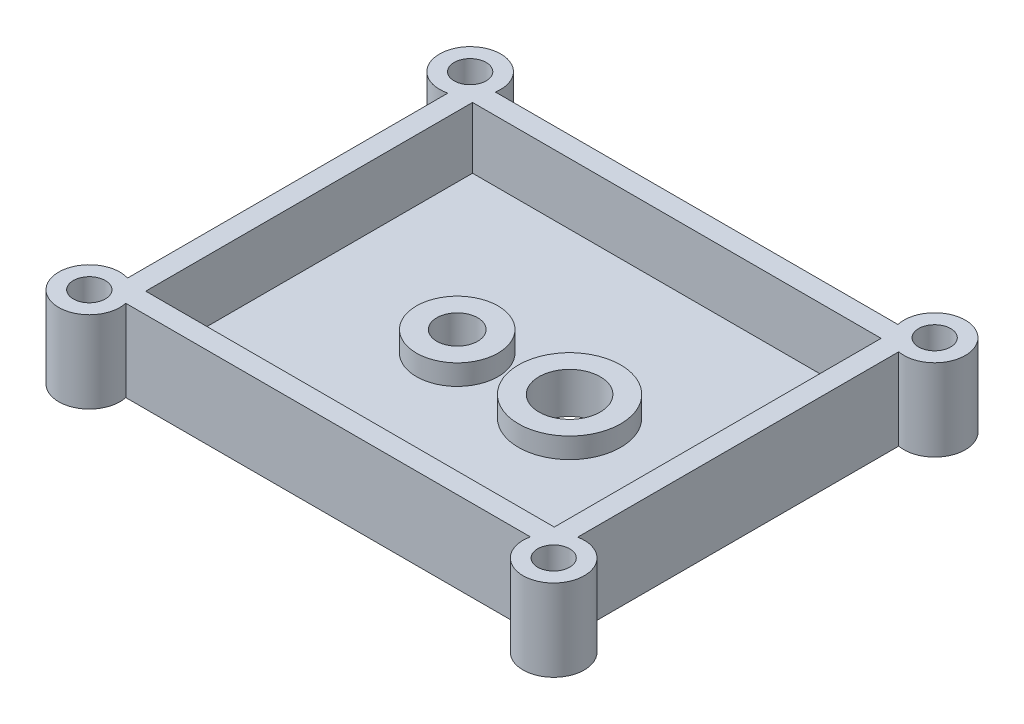
ISO-10303-21;
HEADER;
FILE_DESCRIPTION(('STEP AP214'),'2;1');
FILE_NAME('part.step','',(''),(''),'','','');
FILE_SCHEMA(('AUTOMOTIVE_DESIGN { 1 0 10303 214 1 1 1 1 }'));
ENDSEC;
DATA;
#1=APPLICATION_CONTEXT('core data for automotive mechanical design processes');
#2=APPLICATION_PROTOCOL_DEFINITION('international standard','automotive_design',2000,#1);
#3=PRODUCT_CONTEXT('',#1,'mechanical');
#4=PRODUCT('Part','Part','',(#3));
#5=PRODUCT_RELATED_PRODUCT_CATEGORY('part','',(#4));
#6=PRODUCT_DEFINITION_FORMATION('','',#4);
#7=PRODUCT_DEFINITION_CONTEXT('part definition',#1,'design');
#8=PRODUCT_DEFINITION('design','',#6,#7);
#9=PRODUCT_DEFINITION_SHAPE('','',#8);
#10=(LENGTH_UNIT() NAMED_UNIT(*) SI_UNIT(.MILLI.,.METRE.));
#11=(NAMED_UNIT(*) PLANE_ANGLE_UNIT() SI_UNIT($,.RADIAN.));
#12=(NAMED_UNIT(*) SI_UNIT($,.STERADIAN.) SOLID_ANGLE_UNIT());
#13=UNCERTAINTY_MEASURE_WITH_UNIT(LENGTH_MEASURE(1.E-05),#10,'distance_accuracy_value','');
#14=(GEOMETRIC_REPRESENTATION_CONTEXT(3) GLOBAL_UNCERTAINTY_ASSIGNED_CONTEXT((#13)) GLOBAL_UNIT_ASSIGNED_CONTEXT((#10,
#11,#12)) REPRESENTATION_CONTEXT('',''));
#15=CARTESIAN_POINT('',(0.,0.,0.));
#16=DIRECTION('',(0.,0.,1.));
#17=DIRECTION('',(1.,0.,0.));
#18=AXIS2_PLACEMENT_3D('',#15,#16,#17);
#19=CARTESIAN_POINT('',(34.925,12.7,28.575));
#20=DIRECTION('',(-1.,0.,0.));
#21=DIRECTION('',(0.,0.,1.));
#22=AXIS2_PLACEMENT_3D('',#19,#20,#21);
#23=PLANE('',#22);
#24=DIRECTION('',(0.,0.,-1.));
#25=VECTOR('',#24,1.);
#26=CARTESIAN_POINT('',(34.925,12.7,28.575));
#27=LINE('',#26,#25);
#28=CARTESIAN_POINT('',(34.925,12.7,24.9397895282315));
#29=VERTEX_POINT('',#28);
#30=CARTESIAN_POINT('',(34.925,12.7,-24.9617511410447));
#31=VERTEX_POINT('',#30);
#32=EDGE_CURVE('E165',#29,#31,#27,.T.);
#33=ORIENTED_EDGE('',*,*,#32,.F.);
#34=DIRECTION('',(0.,1.,0.));
#35=VECTOR('',#34,1.);
#36=CARTESIAN_POINT('',(34.925,0.,24.9397895282315));
#37=LINE('',#36,#35);
#38=CARTESIAN_POINT('',(34.925,0.,24.9397895282315));
#39=VERTEX_POINT('',#38);
#40=EDGE_CURVE('E234',#29,#39,#37,.F.);
#41=ORIENTED_EDGE('',*,*,#40,.T.);
#42=DIRECTION('',(0.,0.,-1.));
#43=VECTOR('',#42,1.);
#44=CARTESIAN_POINT('',(34.925,0.,28.575));
#45=LINE('',#44,#43);
#46=CARTESIAN_POINT('',(34.925,0.,-24.9617511410447));
#47=VERTEX_POINT('',#46);
#48=EDGE_CURVE('E155',#39,#47,#45,.T.);
#49=ORIENTED_EDGE('',*,*,#48,.T.);
#50=DIRECTION('',(0.,1.,0.));
#51=VECTOR('',#50,1.);
#52=CARTESIAN_POINT('',(34.925,0.,-24.9617511410447));
#53=LINE('',#52,#51);
#54=EDGE_CURVE('E239',#47,#31,#53,.T.);
#55=ORIENTED_EDGE('',*,*,#54,.T.);
#56=EDGE_LOOP('',(#33,#41,#49,#55));
#57=FACE_BOUND('',#56,.T.);
#58=ADVANCED_FACE('F39',(#57),#23,.F.);
#59=CARTESIAN_POINT('',(-34.925,12.7,-28.575));
#60=DIRECTION('',(0.,0.,1.));
#61=DIRECTION('',(1.,0.,0.));
#62=AXIS2_PLACEMENT_3D('',#59,#60,#61);
#63=PLANE('',#62);
#64=DIRECTION('',(-1.,0.,0.));
#65=VECTOR('',#64,1.);
#66=CARTESIAN_POINT('',(-34.925,12.7,-28.575));
#67=LINE('',#66,#65);
#68=CARTESIAN_POINT('',(31.1900740487613,12.7,-28.575));
#69=VERTEX_POINT('',#68);
#70=CARTESIAN_POINT('',(-31.3834978217363,12.7,-28.575));
#71=VERTEX_POINT('',#70);
#72=EDGE_CURVE('E175',#69,#71,#67,.T.);
#73=ORIENTED_EDGE('',*,*,#72,.F.);
#74=DIRECTION('',(0.,1.,0.));
#75=VECTOR('',#74,1.);
#76=CARTESIAN_POINT('',(31.1900740487613,0.,-28.575));
#77=LINE('',#76,#75);
#78=CARTESIAN_POINT('',(31.1900740487613,0.,-28.575));
#79=VERTEX_POINT('',#78);
#80=EDGE_CURVE('E140',#69,#79,#77,.F.);
#81=ORIENTED_EDGE('',*,*,#80,.T.);
#82=DIRECTION('',(-1.,0.,0.));
#83=VECTOR('',#82,1.);
#84=CARTESIAN_POINT('',(-34.925,0.,-28.575));
#85=LINE('',#84,#83);
#86=CARTESIAN_POINT('',(-31.3834978217363,0.,-28.575));
#87=VERTEX_POINT('',#86);
#88=EDGE_CURVE('E148',#79,#87,#85,.T.);
#89=ORIENTED_EDGE('',*,*,#88,.T.);
#90=DIRECTION('',(0.,1.,0.));
#91=VECTOR('',#90,1.);
#92=CARTESIAN_POINT('',(-31.3834978217363,0.,-28.575));
#93=LINE('',#92,#91);
#94=EDGE_CURVE('E127',#87,#71,#93,.T.);
#95=ORIENTED_EDGE('',*,*,#94,.T.);
#96=EDGE_LOOP('',(#73,#81,#89,#95));
#97=FACE_BOUND('',#96,.T.);
#98=ADVANCED_FACE('F151',(#97),#63,.F.);
#99=CARTESIAN_POINT('',(-34.925,12.7,28.575));
#100=DIRECTION('',(1.,0.,0.));
#101=DIRECTION('',(0.,0.,-1.));
#102=AXIS2_PLACEMENT_3D('',#99,#100,#101);
#103=PLANE('',#102);
#104=DIRECTION('',(0.,0.,1.));
#105=VECTOR('',#104,1.);
#106=CARTESIAN_POINT('',(-34.925,0.,28.575));
#107=LINE('',#106,#105);
#108=CARTESIAN_POINT('',(-34.925,0.,-24.7393888212025));
#109=VERTEX_POINT('',#108);
#110=CARTESIAN_POINT('',(-34.925,0.,25.0375604846747));
#111=VERTEX_POINT('',#110);
#112=EDGE_CURVE('E149',#109,#111,#107,.T.);
#113=ORIENTED_EDGE('',*,*,#112,.T.);
#114=DIRECTION('',(0.,1.,0.));
#115=VECTOR('',#114,1.);
#116=CARTESIAN_POINT('',(-34.925,0.,25.0375604846747));
#117=LINE('',#116,#115);
#118=CARTESIAN_POINT('',(-34.925,12.7,25.0375604846747));
#119=VERTEX_POINT('',#118);
#120=EDGE_CURVE('E230',#111,#119,#117,.T.);
#121=ORIENTED_EDGE('',*,*,#120,.T.);
#122=DIRECTION('',(0.,0.,1.));
#123=VECTOR('',#122,1.);
#124=CARTESIAN_POINT('',(-34.925,12.7,28.575));
#125=LINE('',#124,#123);
#126=CARTESIAN_POINT('',(-34.925,12.7,-24.7393888212025));
#127=VERTEX_POINT('',#126);
#128=EDGE_CURVE('E169',#127,#119,#125,.T.);
#129=ORIENTED_EDGE('',*,*,#128,.F.);
#130=DIRECTION('',(0.,1.,0.));
#131=VECTOR('',#130,1.);
#132=CARTESIAN_POINT('',(-34.925,0.,-24.7393888212025));
#133=LINE('',#132,#131);
#134=EDGE_CURVE('E136',#127,#109,#133,.F.);
#135=ORIENTED_EDGE('',*,*,#134,.T.);
#136=EDGE_LOOP('',(#113,#121,#129,#135));
#137=FACE_BOUND('',#136,.T.);
#138=ADVANCED_FACE('F335',(#137),#103,.F.);
#139=CARTESIAN_POINT('',(-34.925,12.7,28.575));
#140=DIRECTION('',(0.,0.,-1.));
#141=DIRECTION('',(-1.,0.,0.));
#142=AXIS2_PLACEMENT_3D('',#139,#140,#141);
#143=PLANE('',#142);
#144=DIRECTION('',(1.,0.,0.));
#145=VECTOR('',#144,1.);
#146=CARTESIAN_POINT('',(-34.925,12.7,28.575));
#147=LINE('',#146,#145);
#148=CARTESIAN_POINT('',(-31.6690390316661,12.7,28.575));
#149=VERTEX_POINT('',#148);
#150=CARTESIAN_POINT('',(31.2158026670803,12.7,28.575));
#151=VERTEX_POINT('',#150);
#152=EDGE_CURVE('E163',#149,#151,#147,.T.);
#153=ORIENTED_EDGE('',*,*,#152,.F.);
#154=DIRECTION('',(0.,1.,0.));
#155=VECTOR('',#154,1.);
#156=CARTESIAN_POINT('',(-31.6690390316661,0.,28.575));
#157=LINE('',#156,#155);
#158=CARTESIAN_POINT('',(-31.6690390316661,0.,28.575));
#159=VERTEX_POINT('',#158);
#160=EDGE_CURVE('E233',#149,#159,#157,.F.);
#161=ORIENTED_EDGE('',*,*,#160,.T.);
#162=DIRECTION('',(1.,0.,0.));
#163=VECTOR('',#162,1.);
#164=CARTESIAN_POINT('',(-34.925,0.,28.575));
#165=LINE('',#164,#163);
#166=CARTESIAN_POINT('',(31.2158026670803,0.,28.575));
#167=VERTEX_POINT('',#166);
#168=EDGE_CURVE('E152',#159,#167,#165,.T.);
#169=ORIENTED_EDGE('',*,*,#168,.T.);
#170=DIRECTION('',(0.,1.,0.));
#171=VECTOR('',#170,1.);
#172=CARTESIAN_POINT('',(31.2158026670803,0.,28.575));
#173=LINE('',#172,#171);
#174=EDGE_CURVE('E240',#167,#151,#173,.T.);
#175=ORIENTED_EDGE('',*,*,#174,.T.);
#176=EDGE_LOOP('',(#153,#161,#169,#175));
#177=FACE_BOUND('',#176,.T.);
#178=ADVANCED_FACE('F288',(#177),#143,.F.);
#179=CARTESIAN_POINT('',(0.,12.7,0.));
#180=DIRECTION('',(0.,-1.,0.));
#181=DIRECTION('',(0.,0.,-1.));
#182=AXIS2_PLACEMENT_3D('',#179,#180,#181);
#183=PLANE('',#182);
#184=CARTESIAN_POINT('',(35.8326653027773,12.7,-29.6369570133175));
#185=DIRECTION('',(0.,1.,0.));
#186=DIRECTION('',(0.,0.,1.));
#187=AXIS2_PLACEMENT_3D('',#184,#185,#186);
#188=CIRCLE('',#187,2.4892);
#189=CARTESIAN_POINT('',(35.8326653027773,12.7,-27.1477570133175));
#190=VERTEX_POINT('',#189);
#191=EDGE_CURVE('E266',#190,#190,#188,.T.);
#192=ORIENTED_EDGE('',*,*,#191,.F.);
#193=EDGE_LOOP('',(#192));
#194=FACE_BOUND('',#193,.T.);
#195=CARTESIAN_POINT('',(35.8647791179222,12.7,29.6086460755585));
#196=DIRECTION('',(0.,1.,0.));
#197=DIRECTION('',(0.,0.,1.));
#198=AXIS2_PLACEMENT_3D('',#195,#196,#197);
#199=CIRCLE('',#198,2.4892);
#200=CARTESIAN_POINT('',(35.8647791179222,12.7,32.0978460755585));
#201=VERTEX_POINT('',#200);
#202=EDGE_CURVE('E275',#201,#201,#199,.T.);
#203=ORIENTED_EDGE('',*,*,#202,.F.);
#204=EDGE_LOOP('',(#203));
#205=FACE_BOUND('',#204,.T.);
#206=CARTESIAN_POINT('',(-36.322,12.7,29.5905591943165));
#207=DIRECTION('',(0.,1.,0.));
#208=DIRECTION('',(0.,0.,1.));
#209=AXIS2_PLACEMENT_3D('',#206,#207,#208);
#210=CIRCLE('',#209,2.4892);
#211=CARTESIAN_POINT('',(-36.322,12.7,32.0797591943165));
#212=VERTEX_POINT('',#211);
#213=EDGE_CURVE('E257',#212,#212,#210,.T.);
#214=ORIENTED_EDGE('',*,*,#213,.F.);
#215=EDGE_LOOP('',(#214));
#216=FACE_BOUND('',#215,.T.);
#217=CARTESIAN_POINT('',(-36.0809444494494,12.7,-29.3594752576004));
#218=DIRECTION('',(0.,1.,0.));
#219=DIRECTION('',(0.,0.,1.));
#220=AXIS2_PLACEMENT_3D('',#217,#218,#219);
#221=CIRCLE('',#220,2.4892);
#222=CARTESIAN_POINT('',(-36.0809444494494,12.7,-26.8702752576004));
#223=VERTEX_POINT('',#222);
#224=EDGE_CURVE('E260',#223,#223,#221,.T.);
#225=ORIENTED_EDGE('',*,*,#224,.F.);
#226=EDGE_LOOP('',(#225));
#227=FACE_BOUND('',#226,.T.);
#228=CARTESIAN_POINT('',(35.8647791179222,12.7,29.6086460755585));
#229=DIRECTION('',(0.,1.,0.));
#230=DIRECTION('',(0.,0.,1.));
#231=AXIS2_PLACEMENT_3D('',#228,#229,#230);
#232=CIRCLE('',#231,4.7625);
#233=EDGE_CURVE('E52',#151,#29,#232,.T.);
#234=ORIENTED_EDGE('',*,*,#233,.T.);
#235=ORIENTED_EDGE('',*,*,#32,.T.);
#236=CARTESIAN_POINT('',(35.8326653027773,12.7,-29.6369570133175));
#237=DIRECTION('',(0.,1.,0.));
#238=DIRECTION('',(0.,0.,1.));
#239=AXIS2_PLACEMENT_3D('',#236,#237,#238);
#240=CIRCLE('',#239,4.7625);
#241=EDGE_CURVE('E243',#31,#69,#240,.T.);
#242=ORIENTED_EDGE('',*,*,#241,.T.);
#243=ORIENTED_EDGE('',*,*,#72,.T.);
#244=CARTESIAN_POINT('',(-36.0809444494494,12.7,-29.3594752576004));
#245=DIRECTION('',(0.,1.,0.));
#246=DIRECTION('',(0.,0.,1.));
#247=AXIS2_PLACEMENT_3D('',#244,#245,#246);
#248=CIRCLE('',#247,4.7625);
#249=EDGE_CURVE('E131',#71,#127,#248,.T.);
#250=ORIENTED_EDGE('',*,*,#249,.T.);
#251=ORIENTED_EDGE('',*,*,#128,.T.);
#252=CARTESIAN_POINT('',(-36.322,12.7,29.5905591943165));
#253=DIRECTION('',(0.,1.,0.));
#254=DIRECTION('',(0.,0.,1.));
#255=AXIS2_PLACEMENT_3D('',#252,#253,#254);
#256=CIRCLE('',#255,4.7625);
#257=EDGE_CURVE('E246',#119,#149,#256,.T.);
#258=ORIENTED_EDGE('',*,*,#257,.T.);
#259=ORIENTED_EDGE('',*,*,#152,.T.);
#260=EDGE_LOOP('',(#234,#235,#242,#243,#250,#251,#258,#259));
#261=FACE_BOUND('',#260,.T.);
#262=DIRECTION('',(-1.,0.,0.));
#263=VECTOR('',#262,1.);
#264=CARTESIAN_POINT('',(-31.75,12.7,-25.4));
#265=LINE('',#264,#263);
#266=CARTESIAN_POINT('',(31.75,12.7,-25.4));
#267=VERTEX_POINT('',#266);
#268=CARTESIAN_POINT('',(-31.75,12.7,-25.4));
#269=VERTEX_POINT('',#268);
#270=EDGE_CURVE('E192',#267,#269,#265,.T.);
#271=ORIENTED_EDGE('',*,*,#270,.F.);
#272=DIRECTION('',(0.,0.,-1.));
#273=VECTOR('',#272,1.);
#274=CARTESIAN_POINT('',(31.75,12.7,25.4));
#275=LINE('',#274,#273);
#276=CARTESIAN_POINT('',(31.75,12.7,25.4));
#277=VERTEX_POINT('',#276);
#278=EDGE_CURVE('E196',#277,#267,#275,.T.);
#279=ORIENTED_EDGE('',*,*,#278,.F.);
#280=DIRECTION('',(1.,0.,0.));
#281=VECTOR('',#280,1.);
#282=CARTESIAN_POINT('',(-31.75,12.7,25.4));
#283=LINE('',#282,#281);
#284=CARTESIAN_POINT('',(-31.75,12.7,25.4));
#285=VERTEX_POINT('',#284);
#286=EDGE_CURVE('E190',#285,#277,#283,.T.);
#287=ORIENTED_EDGE('',*,*,#286,.F.);
#288=DIRECTION('',(0.,0.,1.));
#289=VECTOR('',#288,1.);
#290=CARTESIAN_POINT('',(-31.75,12.7,25.4));
#291=LINE('',#290,#289);
#292=EDGE_CURVE('E195',#269,#285,#291,.T.);
#293=ORIENTED_EDGE('',*,*,#292,.F.);
#294=EDGE_LOOP('',(#271,#279,#287,#293));
#295=FACE_BOUND('',#294,.T.);
#296=ADVANCED_FACE('F285',(#194,#205,#216,#227,#261,#295),#183,.F.);
#297=CARTESIAN_POINT('',(0.,0.,0.));
#298=DIRECTION('',(0.,-1.,0.));
#299=DIRECTION('',(0.,0.,-1.));
#300=AXIS2_PLACEMENT_3D('',#297,#298,#299);
#301=PLANE('',#300);
#302=CARTESIAN_POINT('',(35.8326653027773,0.,-29.6369570133175));
#303=DIRECTION('',(0.,1.,0.));
#304=DIRECTION('',(0.,0.,1.));
#305=AXIS2_PLACEMENT_3D('',#302,#303,#304);
#306=CIRCLE('',#305,2.4892);
#307=CARTESIAN_POINT('',(35.8326653027773,0.,-27.1477570133175));
#308=VERTEX_POINT('',#307);
#309=EDGE_CURVE('E263',#308,#308,#306,.T.);
#310=ORIENTED_EDGE('',*,*,#309,.T.);
#311=EDGE_LOOP('',(#310));
#312=FACE_BOUND('',#311,.T.);
#313=CARTESIAN_POINT('',(35.8647791179222,0.,29.6086460755585));
#314=DIRECTION('',(0.,1.,0.));
#315=DIRECTION('',(0.,0.,1.));
#316=AXIS2_PLACEMENT_3D('',#313,#314,#315);
#317=CIRCLE('',#316,2.4892);
#318=CARTESIAN_POINT('',(35.8647791179222,0.,32.0978460755585));
#319=VERTEX_POINT('',#318);
#320=EDGE_CURVE('E267',#319,#319,#317,.T.);
#321=ORIENTED_EDGE('',*,*,#320,.T.);
#322=EDGE_LOOP('',(#321));
#323=FACE_BOUND('',#322,.T.);
#324=CARTESIAN_POINT('',(-36.322,0.,29.5905591943165));
#325=DIRECTION('',(0.,1.,0.));
#326=DIRECTION('',(0.,0.,1.));
#327=AXIS2_PLACEMENT_3D('',#324,#325,#326);
#328=CIRCLE('',#327,2.4892);
#329=CARTESIAN_POINT('',(-36.322,0.,32.0797591943165));
#330=VERTEX_POINT('',#329);
#331=EDGE_CURVE('E274',#330,#330,#328,.T.);
#332=ORIENTED_EDGE('',*,*,#331,.T.);
#333=EDGE_LOOP('',(#332));
#334=FACE_BOUND('',#333,.T.);
#335=CARTESIAN_POINT('',(-36.0809444494494,0.,-29.3594752576004));
#336=DIRECTION('',(0.,1.,0.));
#337=DIRECTION('',(0.,0.,1.));
#338=AXIS2_PLACEMENT_3D('',#335,#336,#337);
#339=CIRCLE('',#338,2.4892);
#340=CARTESIAN_POINT('',(-36.0809444494494,0.,-26.8702752576004));
#341=VERTEX_POINT('',#340);
#342=EDGE_CURVE('E249',#341,#341,#339,.T.);
#343=ORIENTED_EDGE('',*,*,#342,.T.);
#344=EDGE_LOOP('',(#343));
#345=FACE_BOUND('',#344,.T.);
#346=ORIENTED_EDGE('',*,*,#168,.F.);
#347=CARTESIAN_POINT('',(-36.322,0.,29.5905591943165));
#348=DIRECTION('',(0.,1.,0.));
#349=DIRECTION('',(0.,0.,1.));
#350=AXIS2_PLACEMENT_3D('',#347,#348,#349);
#351=CIRCLE('',#350,4.7625);
#352=EDGE_CURVE('E248',#111,#159,#351,.T.);
#353=ORIENTED_EDGE('',*,*,#352,.F.);
#354=ORIENTED_EDGE('',*,*,#112,.F.);
#355=CARTESIAN_POINT('',(-36.0809444494494,0.,-29.3594752576004));
#356=DIRECTION('',(0.,1.,0.));
#357=DIRECTION('',(0.,0.,1.));
#358=AXIS2_PLACEMENT_3D('',#355,#356,#357);
#359=CIRCLE('',#358,4.7625);
#360=EDGE_CURVE('E129',#87,#109,#359,.T.);
#361=ORIENTED_EDGE('',*,*,#360,.F.);
#362=ORIENTED_EDGE('',*,*,#88,.F.);
#363=CARTESIAN_POINT('',(35.8326653027773,0.,-29.6369570133175));
#364=DIRECTION('',(0.,1.,0.));
#365=DIRECTION('',(0.,0.,1.));
#366=AXIS2_PLACEMENT_3D('',#363,#364,#365);
#367=CIRCLE('',#366,4.7625);
#368=EDGE_CURVE('E64',#47,#79,#367,.T.);
#369=ORIENTED_EDGE('',*,*,#368,.F.);
#370=ORIENTED_EDGE('',*,*,#48,.F.);
#371=CARTESIAN_POINT('',(35.8647791179222,0.,29.6086460755585));
#372=DIRECTION('',(0.,1.,0.));
#373=DIRECTION('',(0.,0.,1.));
#374=AXIS2_PLACEMENT_3D('',#371,#372,#373);
#375=CIRCLE('',#374,4.7625);
#376=EDGE_CURVE('E253',#167,#39,#375,.T.);
#377=ORIENTED_EDGE('',*,*,#376,.F.);
#378=EDGE_LOOP('',(#346,#353,#354,#361,#362,#369,#370,#377));
#379=FACE_BOUND('',#378,.T.);
#380=CARTESIAN_POINT('',(8.73125,0.,0.));
#381=DIRECTION('',(0.,1.,0.));
#382=DIRECTION('',(0.,0.,1.));
#383=AXIS2_PLACEMENT_3D('',#380,#381,#382);
#384=CIRCLE('',#383,4.7625);
#385=CARTESIAN_POINT('',(8.73125,0.,4.7625));
#386=VERTEX_POINT('',#385);
#387=EDGE_CURVE('E223',#386,#386,#384,.T.);
#388=ORIENTED_EDGE('',*,*,#387,.T.);
#389=EDGE_LOOP('',(#388));
#390=FACE_BOUND('',#389,.T.);
#391=CARTESIAN_POINT('',(-8.73125,0.,0.));
#392=DIRECTION('',(0.,1.,0.));
#393=DIRECTION('',(0.,0.,1.));
#394=AXIS2_PLACEMENT_3D('',#391,#392,#393);
#395=CIRCLE('',#394,3.175);
#396=CARTESIAN_POINT('',(-8.73125,0.,3.175));
#397=VERTEX_POINT('',#396);
#398=EDGE_CURVE('E217',#397,#397,#395,.T.);
#399=ORIENTED_EDGE('',*,*,#398,.T.);
#400=EDGE_LOOP('',(#399));
#401=FACE_BOUND('',#400,.T.);
#402=ADVANCED_FACE('F145',(#312,#323,#334,#345,#379,#390,#401),#301,.T.);
#403=CARTESIAN_POINT('',(31.75,3.175,25.4));
#404=DIRECTION('',(1.,0.,0.));
#405=DIRECTION('',(0.,0.,-1.));
#406=AXIS2_PLACEMENT_3D('',#403,#404,#405);
#407=PLANE('',#406);
#408=ORIENTED_EDGE('',*,*,#278,.T.);
#409=DIRECTION('',(0.,1.,0.));
#410=VECTOR('',#409,1.);
#411=CARTESIAN_POINT('',(31.75,3.175,-25.4));
#412=LINE('',#411,#410);
#413=CARTESIAN_POINT('',(31.75,3.175,-25.4));
#414=VERTEX_POINT('',#413);
#415=EDGE_CURVE('E179',#414,#267,#412,.T.);
#416=ORIENTED_EDGE('',*,*,#415,.F.);
#417=DIRECTION('',(0.,0.,-1.));
#418=VECTOR('',#417,1.);
#419=CARTESIAN_POINT('',(31.75,3.175,25.4));
#420=LINE('',#419,#418);
#421=CARTESIAN_POINT('',(31.75,3.175,25.4));
#422=VERTEX_POINT('',#421);
#423=EDGE_CURVE('E193',#422,#414,#420,.T.);
#424=ORIENTED_EDGE('',*,*,#423,.F.);
#425=DIRECTION('',(0.,1.,0.));
#426=VECTOR('',#425,1.);
#427=CARTESIAN_POINT('',(31.75,3.175,25.4));
#428=LINE('',#427,#426);
#429=EDGE_CURVE('E160',#422,#277,#428,.T.);
#430=ORIENTED_EDGE('',*,*,#429,.T.);
#431=EDGE_LOOP('',(#408,#416,#424,#430));
#432=FACE_BOUND('',#431,.T.);
#433=ADVANCED_FACE('F305',(#432),#407,.F.);
#434=CARTESIAN_POINT('',(-31.75,3.175,25.4));
#435=DIRECTION('',(0.,0.,1.));
#436=DIRECTION('',(1.,0.,0.));
#437=AXIS2_PLACEMENT_3D('',#434,#435,#436);
#438=PLANE('',#437);
#439=ORIENTED_EDGE('',*,*,#286,.T.);
#440=ORIENTED_EDGE('',*,*,#429,.F.);
#441=DIRECTION('',(1.,0.,0.));
#442=VECTOR('',#441,1.);
#443=CARTESIAN_POINT('',(-31.75,3.175,25.4));
#444=LINE('',#443,#442);
#445=CARTESIAN_POINT('',(-31.75,3.175,25.4));
#446=VERTEX_POINT('',#445);
#447=EDGE_CURVE('E181',#446,#422,#444,.T.);
#448=ORIENTED_EDGE('',*,*,#447,.F.);
#449=DIRECTION('',(0.,1.,0.));
#450=VECTOR('',#449,1.);
#451=CARTESIAN_POINT('',(-31.75,3.175,25.4));
#452=LINE('',#451,#450);
#453=EDGE_CURVE('E183',#446,#285,#452,.T.);
#454=ORIENTED_EDGE('',*,*,#453,.T.);
#455=EDGE_LOOP('',(#439,#440,#448,#454));
#456=FACE_BOUND('',#455,.T.);
#457=ADVANCED_FACE('F302',(#456),#438,.F.);
#458=CARTESIAN_POINT('',(-31.75,3.175,25.4));
#459=DIRECTION('',(-1.,0.,0.));
#460=DIRECTION('',(0.,0.,1.));
#461=AXIS2_PLACEMENT_3D('',#458,#459,#460);
#462=PLANE('',#461);
#463=ORIENTED_EDGE('',*,*,#292,.T.);
#464=ORIENTED_EDGE('',*,*,#453,.F.);
#465=DIRECTION('',(0.,0.,1.));
#466=VECTOR('',#465,1.);
#467=CARTESIAN_POINT('',(-31.75,3.175,25.4));
#468=LINE('',#467,#466);
#469=CARTESIAN_POINT('',(-31.75,3.175,-25.4));
#470=VERTEX_POINT('',#469);
#471=EDGE_CURVE('E201',#470,#446,#468,.T.);
#472=ORIENTED_EDGE('',*,*,#471,.F.);
#473=DIRECTION('',(0.,1.,0.));
#474=VECTOR('',#473,1.);
#475=CARTESIAN_POINT('',(-31.75,3.175,-25.4));
#476=LINE('',#475,#474);
#477=EDGE_CURVE('E185',#470,#269,#476,.T.);
#478=ORIENTED_EDGE('',*,*,#477,.T.);
#479=EDGE_LOOP('',(#463,#464,#472,#478));
#480=FACE_BOUND('',#479,.T.);
#481=ADVANCED_FACE('F307',(#480),#462,.F.);
#482=CARTESIAN_POINT('',(-31.75,3.175,-25.4));
#483=DIRECTION('',(0.,0.,-1.));
#484=DIRECTION('',(-1.,0.,0.));
#485=AXIS2_PLACEMENT_3D('',#482,#483,#484);
#486=PLANE('',#485);
#487=ORIENTED_EDGE('',*,*,#270,.T.);
#488=ORIENTED_EDGE('',*,*,#477,.F.);
#489=DIRECTION('',(-1.,0.,0.));
#490=VECTOR('',#489,1.);
#491=CARTESIAN_POINT('',(-31.75,3.175,-25.4));
#492=LINE('',#491,#490);
#493=EDGE_CURVE('E206',#414,#470,#492,.T.);
#494=ORIENTED_EDGE('',*,*,#493,.F.);
#495=ORIENTED_EDGE('',*,*,#415,.T.);
#496=EDGE_LOOP('',(#487,#488,#494,#495));
#497=FACE_BOUND('',#496,.T.);
#498=ADVANCED_FACE('F296',(#497),#486,.F.);
#499=CARTESIAN_POINT('',(0.,3.175,0.));
#500=DIRECTION('',(0.,-1.,0.));
#501=DIRECTION('',(0.,0.,-1.));
#502=AXIS2_PLACEMENT_3D('',#499,#500,#501);
#503=PLANE('',#502);
#504=CARTESIAN_POINT('',(-8.73125,3.175,0.));
#505=DIRECTION('',(0.,-1.,0.));
#506=DIRECTION('',(0.,0.,-1.));
#507=AXIS2_PLACEMENT_3D('',#504,#505,#506);
#508=CIRCLE('',#507,6.35);
#509=CARTESIAN_POINT('',(-8.73125,3.175,-6.35));
#510=VERTEX_POINT('',#509);
#511=EDGE_CURVE('E11',#510,#510,#508,.F.);
#512=ORIENTED_EDGE('',*,*,#511,.F.);
#513=EDGE_LOOP('',(#512));
#514=FACE_BOUND('',#513,.T.);
#515=CARTESIAN_POINT('',(8.73125,3.175,0.));
#516=DIRECTION('',(0.,-1.,0.));
#517=DIRECTION('',(0.,0.,-1.));
#518=AXIS2_PLACEMENT_3D('',#515,#516,#517);
#519=CIRCLE('',#518,7.9375);
#520=CARTESIAN_POINT('',(8.73125,3.175,-7.9375));
#521=VERTEX_POINT('',#520);
#522=EDGE_CURVE('E46',#521,#521,#519,.F.);
#523=ORIENTED_EDGE('',*,*,#522,.F.);
#524=EDGE_LOOP('',(#523));
#525=FACE_BOUND('',#524,.T.);
#526=ORIENTED_EDGE('',*,*,#423,.T.);
#527=ORIENTED_EDGE('',*,*,#493,.T.);
#528=ORIENTED_EDGE('',*,*,#471,.T.);
#529=ORIENTED_EDGE('',*,*,#447,.T.);
#530=EDGE_LOOP('',(#526,#527,#528,#529));
#531=FACE_BOUND('',#530,.T.);
#532=ADVANCED_FACE('F310',(#514,#525,#531),#503,.F.);
#533=CARTESIAN_POINT('',(8.73125,6.35,0.));
#534=DIRECTION('',(0.,1.,0.));
#535=DIRECTION('',(0.,0.,1.));
#536=AXIS2_PLACEMENT_3D('',#533,#534,#535);
#537=PLANE('',#536);
#538=CARTESIAN_POINT('',(8.73125,6.35,0.));
#539=DIRECTION('',(0.,1.,0.));
#540=DIRECTION('',(0.,0.,1.));
#541=AXIS2_PLACEMENT_3D('',#538,#539,#540);
#542=CIRCLE('',#541,7.9375);
#543=CARTESIAN_POINT('',(8.73125,6.35,7.9375));
#544=VERTEX_POINT('',#543);
#545=EDGE_CURVE('E214',#544,#544,#542,.T.);
#546=ORIENTED_EDGE('',*,*,#545,.T.);
#547=EDGE_LOOP('',(#546));
#548=FACE_BOUND('',#547,.T.);
#549=CARTESIAN_POINT('',(8.73125,6.35,0.));
#550=DIRECTION('',(0.,1.,0.));
#551=DIRECTION('',(0.,0.,1.));
#552=AXIS2_PLACEMENT_3D('',#549,#550,#551);
#553=CIRCLE('',#552,4.7625);
#554=CARTESIAN_POINT('',(8.73125,6.35,4.7625));
#555=VERTEX_POINT('',#554);
#556=EDGE_CURVE('E211',#555,#555,#553,.T.);
#557=ORIENTED_EDGE('',*,*,#556,.F.);
#558=EDGE_LOOP('',(#557));
#559=FACE_BOUND('',#558,.T.);
#560=ADVANCED_FACE('F313',(#548,#559),#537,.T.);
#561=CARTESIAN_POINT('',(8.73125,6.35,0.));
#562=DIRECTION('',(0.,-1.,0.));
#563=DIRECTION('',(0.,0.,-1.));
#564=AXIS2_PLACEMENT_3D('',#561,#562,#563);
#565=CYLINDRICAL_SURFACE('',#564,7.9375);
#566=ORIENTED_EDGE('',*,*,#545,.F.);
#567=EDGE_LOOP('',(#566));
#568=FACE_BOUND('',#567,.T.);
#569=ORIENTED_EDGE('',*,*,#522,.T.);
#570=EDGE_LOOP('',(#569));
#571=FACE_BOUND('',#570,.T.);
#572=ADVANCED_FACE('F318',(#568,#571),#565,.T.);
#573=CARTESIAN_POINT('',(8.73125,6.35,0.));
#574=DIRECTION('',(0.,-1.,0.));
#575=DIRECTION('',(0.,0.,-1.));
#576=AXIS2_PLACEMENT_3D('',#573,#574,#575);
#577=CYLINDRICAL_SURFACE('',#576,4.7625);
#578=ORIENTED_EDGE('',*,*,#556,.T.);
#579=EDGE_LOOP('',(#578));
#580=FACE_BOUND('',#579,.T.);
#581=ORIENTED_EDGE('',*,*,#387,.F.);
#582=EDGE_LOOP('',(#581));
#583=FACE_BOUND('',#582,.T.);
#584=ADVANCED_FACE('F386',(#580,#583),#577,.F.);
#585=CARTESIAN_POINT('',(-8.73125,6.35,0.));
#586=DIRECTION('',(0.,1.,0.));
#587=DIRECTION('',(0.,0.,1.));
#588=AXIS2_PLACEMENT_3D('',#585,#586,#587);
#589=PLANE('',#588);
#590=CARTESIAN_POINT('',(-8.73125,6.35,0.));
#591=DIRECTION('',(0.,1.,0.));
#592=DIRECTION('',(0.,0.,1.));
#593=AXIS2_PLACEMENT_3D('',#590,#591,#592);
#594=CIRCLE('',#593,6.35);
#595=CARTESIAN_POINT('',(-8.73125,6.35,6.35));
#596=VERTEX_POINT('',#595);
#597=EDGE_CURVE('E199',#596,#596,#594,.T.);
#598=ORIENTED_EDGE('',*,*,#597,.T.);
#599=EDGE_LOOP('',(#598));
#600=FACE_BOUND('',#599,.T.);
#601=CARTESIAN_POINT('',(-8.73125,6.35,0.));
#602=DIRECTION('',(0.,1.,0.));
#603=DIRECTION('',(0.,0.,1.));
#604=AXIS2_PLACEMENT_3D('',#601,#602,#603);
#605=CIRCLE('',#604,3.175);
#606=CARTESIAN_POINT('',(-8.73125,6.35,3.175));
#607=VERTEX_POINT('',#606);
#608=EDGE_CURVE('E212',#607,#607,#605,.T.);
#609=ORIENTED_EDGE('',*,*,#608,.F.);
#610=EDGE_LOOP('',(#609));
#611=FACE_BOUND('',#610,.T.);
#612=ADVANCED_FACE('F397',(#600,#611),#589,.T.);
#613=CARTESIAN_POINT('',(-8.73125,6.35,0.));
#614=DIRECTION('',(0.,-1.,0.));
#615=DIRECTION('',(0.,0.,-1.));
#616=AXIS2_PLACEMENT_3D('',#613,#614,#615);
#617=CYLINDRICAL_SURFACE('',#616,6.35);
#618=ORIENTED_EDGE('',*,*,#597,.F.);
#619=EDGE_LOOP('',(#618));
#620=FACE_BOUND('',#619,.T.);
#621=ORIENTED_EDGE('',*,*,#511,.T.);
#622=EDGE_LOOP('',(#621));
#623=FACE_BOUND('',#622,.T.);
#624=ADVANCED_FACE('F413',(#620,#623),#617,.T.);
#625=CARTESIAN_POINT('',(-8.73125,6.35,0.));
#626=DIRECTION('',(0.,-1.,0.));
#627=DIRECTION('',(0.,0.,-1.));
#628=AXIS2_PLACEMENT_3D('',#625,#626,#627);
#629=CYLINDRICAL_SURFACE('',#628,3.175);
#630=ORIENTED_EDGE('',*,*,#608,.T.);
#631=EDGE_LOOP('',(#630));
#632=FACE_BOUND('',#631,.T.);
#633=ORIENTED_EDGE('',*,*,#398,.F.);
#634=EDGE_LOOP('',(#633));
#635=FACE_BOUND('',#634,.T.);
#636=ADVANCED_FACE('F423',(#632,#635),#629,.F.);
#637=CARTESIAN_POINT('',(35.8647791179222,0.,29.6086460755585));
#638=DIRECTION('',(0.,1.,0.));
#639=DIRECTION('',(0.,0.,1.));
#640=AXIS2_PLACEMENT_3D('',#637,#638,#639);
#641=CYLINDRICAL_SURFACE('',#640,4.7625);
#642=ORIENTED_EDGE('',*,*,#40,.F.);
#643=ORIENTED_EDGE('',*,*,#233,.F.);
#644=ORIENTED_EDGE('',*,*,#174,.F.);
#645=ORIENTED_EDGE('',*,*,#376,.T.);
#646=EDGE_LOOP('',(#642,#643,#644,#645));
#647=FACE_BOUND('',#646,.T.);
#648=ADVANCED_FACE('F429',(#647),#641,.T.);
#649=CARTESIAN_POINT('',(-36.322,0.,29.5905591943165));
#650=DIRECTION('',(0.,1.,0.));
#651=DIRECTION('',(0.,0.,1.));
#652=AXIS2_PLACEMENT_3D('',#649,#650,#651);
#653=CYLINDRICAL_SURFACE('',#652,4.7625);
#654=ORIENTED_EDGE('',*,*,#120,.F.);
#655=ORIENTED_EDGE('',*,*,#352,.T.);
#656=ORIENTED_EDGE('',*,*,#160,.F.);
#657=ORIENTED_EDGE('',*,*,#257,.F.);
#658=EDGE_LOOP('',(#654,#655,#656,#657));
#659=FACE_BOUND('',#658,.T.);
#660=ADVANCED_FACE('F340',(#659),#653,.T.);
#661=CARTESIAN_POINT('',(-36.0809444494494,0.,-29.3594752576004));
#662=DIRECTION('',(0.,1.,0.));
#663=DIRECTION('',(0.,0.,1.));
#664=AXIS2_PLACEMENT_3D('',#661,#662,#663);
#665=CYLINDRICAL_SURFACE('',#664,4.7625);
#666=ORIENTED_EDGE('',*,*,#94,.F.);
#667=ORIENTED_EDGE('',*,*,#360,.T.);
#668=ORIENTED_EDGE('',*,*,#134,.F.);
#669=ORIENTED_EDGE('',*,*,#249,.F.);
#670=EDGE_LOOP('',(#666,#667,#668,#669));
#671=FACE_BOUND('',#670,.T.);
#672=ADVANCED_FACE('F126',(#671),#665,.T.);
#673=CARTESIAN_POINT('',(35.8326653027773,0.,-29.6369570133175));
#674=DIRECTION('',(0.,1.,0.));
#675=DIRECTION('',(0.,0.,1.));
#676=AXIS2_PLACEMENT_3D('',#673,#674,#675);
#677=CYLINDRICAL_SURFACE('',#676,4.7625);
#678=ORIENTED_EDGE('',*,*,#54,.F.);
#679=ORIENTED_EDGE('',*,*,#368,.T.);
#680=ORIENTED_EDGE('',*,*,#80,.F.);
#681=ORIENTED_EDGE('',*,*,#241,.F.);
#682=EDGE_LOOP('',(#678,#679,#680,#681));
#683=FACE_BOUND('',#682,.T.);
#684=ADVANCED_FACE('F331',(#683),#677,.T.);
#685=CARTESIAN_POINT('',(-36.0809444494494,0.,-29.3594752576004));
#686=DIRECTION('',(0.,1.,0.));
#687=DIRECTION('',(0.,0.,1.));
#688=AXIS2_PLACEMENT_3D('',#685,#686,#687);
#689=CYLINDRICAL_SURFACE('',#688,2.4892);
#690=ORIENTED_EDGE('',*,*,#342,.F.);
#691=EDGE_LOOP('',(#690));
#692=FACE_BOUND('',#691,.T.);
#693=ORIENTED_EDGE('',*,*,#224,.T.);
#694=EDGE_LOOP('',(#693));
#695=FACE_BOUND('',#694,.T.);
#696=ADVANCED_FACE('F462',(#692,#695),#689,.F.);
#697=CARTESIAN_POINT('',(-36.322,0.,29.5905591943165));
#698=DIRECTION('',(0.,1.,0.));
#699=DIRECTION('',(0.,0.,1.));
#700=AXIS2_PLACEMENT_3D('',#697,#698,#699);
#701=CYLINDRICAL_SURFACE('',#700,2.4892);
#702=ORIENTED_EDGE('',*,*,#331,.F.);
#703=EDGE_LOOP('',(#702));
#704=FACE_BOUND('',#703,.T.);
#705=ORIENTED_EDGE('',*,*,#213,.T.);
#706=EDGE_LOOP('',(#705));
#707=FACE_BOUND('',#706,.T.);
#708=ADVANCED_FACE('F284',(#704,#707),#701,.F.);
#709=CARTESIAN_POINT('',(35.8647791179222,0.,29.6086460755585));
#710=DIRECTION('',(0.,1.,0.));
#711=DIRECTION('',(0.,0.,1.));
#712=AXIS2_PLACEMENT_3D('',#709,#710,#711);
#713=CYLINDRICAL_SURFACE('',#712,2.4892);
#714=ORIENTED_EDGE('',*,*,#320,.F.);
#715=EDGE_LOOP('',(#714));
#716=FACE_BOUND('',#715,.T.);
#717=ORIENTED_EDGE('',*,*,#202,.T.);
#718=EDGE_LOOP('',(#717));
#719=FACE_BOUND('',#718,.T.);
#720=ADVANCED_FACE('F481',(#716,#719),#713,.F.);
#721=CARTESIAN_POINT('',(35.8326653027773,0.,-29.6369570133175));
#722=DIRECTION('',(0.,1.,0.));
#723=DIRECTION('',(0.,0.,1.));
#724=AXIS2_PLACEMENT_3D('',#721,#722,#723);
#725=CYLINDRICAL_SURFACE('',#724,2.4892);
#726=ORIENTED_EDGE('',*,*,#309,.F.);
#727=EDGE_LOOP('',(#726));
#728=FACE_BOUND('',#727,.T.);
#729=ORIENTED_EDGE('',*,*,#191,.T.);
#730=EDGE_LOOP('',(#729));
#731=FACE_BOUND('',#730,.T.);
#732=ADVANCED_FACE('F489',(#728,#731),#725,.F.);
#733=CLOSED_SHELL('',(#58,#98,#138,#178,#296,#402,#433,#457,#481,#498,#532,#560,#572,#584,#612,
#624,#636,#648,#660,#672,#684,#696,#708,#720,#732));
#734=MANIFOLD_SOLID_BREP('B2',#733);
#735=ADVANCED_BREP_SHAPE_REPRESENTATION('',(#18,#734),#14);
#736=SHAPE_DEFINITION_REPRESENTATION(#9,#735);
ENDSEC;
END-ISO-10303-21;
